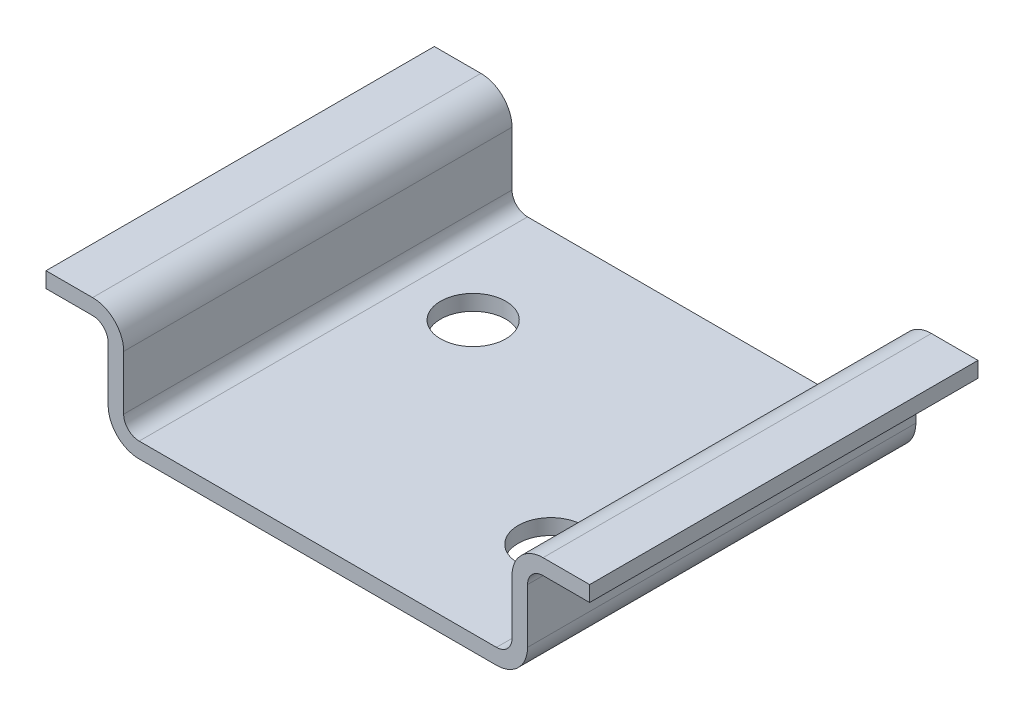
ISO-10303-21;
HEADER;
FILE_DESCRIPTION(('STEP AP214'),'2;1');
FILE_NAME('part.step','',(''),(''),'','','');
FILE_SCHEMA(('AUTOMOTIVE_DESIGN { 1 0 10303 214 1 1 1 1 }'));
ENDSEC;
DATA;
#1=APPLICATION_CONTEXT('core data for automotive mechanical design processes');
#2=APPLICATION_PROTOCOL_DEFINITION('international standard','automotive_design',2000,#1);
#3=PRODUCT_CONTEXT('',#1,'mechanical');
#4=PRODUCT('Part','Part','',(#3));
#5=PRODUCT_RELATED_PRODUCT_CATEGORY('part','',(#4));
#6=PRODUCT_DEFINITION_FORMATION('','',#4);
#7=PRODUCT_DEFINITION_CONTEXT('part definition',#1,'design');
#8=PRODUCT_DEFINITION('design','',#6,#7);
#9=PRODUCT_DEFINITION_SHAPE('','',#8);
#10=(LENGTH_UNIT() NAMED_UNIT(*) SI_UNIT(.MILLI.,.METRE.));
#11=(NAMED_UNIT(*) PLANE_ANGLE_UNIT() SI_UNIT($,.RADIAN.));
#12=(NAMED_UNIT(*) SI_UNIT($,.STERADIAN.) SOLID_ANGLE_UNIT());
#13=UNCERTAINTY_MEASURE_WITH_UNIT(LENGTH_MEASURE(1.E-05),#10,'distance_accuracy_value','');
#14=(GEOMETRIC_REPRESENTATION_CONTEXT(3) GLOBAL_UNCERTAINTY_ASSIGNED_CONTEXT((#13)) GLOBAL_UNIT_ASSIGNED_CONTEXT((#10,
#11,#12)) REPRESENTATION_CONTEXT('',''));
#15=CARTESIAN_POINT('',(0.,0.,0.));
#16=DIRECTION('',(0.,0.,1.));
#17=DIRECTION('',(1.,0.,0.));
#18=AXIS2_PLACEMENT_3D('',#15,#16,#17);
#19=CARTESIAN_POINT('',(-17.5,7.5,90.));
#20=DIRECTION('',(1.,0.,0.));
#21=DIRECTION('',(0.,0.,-1.));
#22=AXIS2_PLACEMENT_3D('',#19,#20,#21);
#23=PLANE('',#22);
#24=DIRECTION('',(0.,-1.,0.));
#25=VECTOR('',#24,1.);
#26=CARTESIAN_POINT('',(-17.5,7.5,25.));
#27=LINE('',#26,#25);
#28=CARTESIAN_POINT('',(-17.5,7.5,25.));
#29=VERTEX_POINT('',#28);
#30=CARTESIAN_POINT('',(-17.5,6.5,25.));
#31=VERTEX_POINT('',#30);
#32=EDGE_CURVE('E164',#29,#31,#27,.T.);
#33=ORIENTED_EDGE('',*,*,#32,.F.);
#34=DIRECTION('',(0.,0.,-1.));
#35=VECTOR('',#34,1.);
#36=CARTESIAN_POINT('',(-17.5,7.5,90.));
#37=LINE('',#36,#35);
#38=CARTESIAN_POINT('',(-17.5,7.5,0.));
#39=VERTEX_POINT('',#38);
#40=EDGE_CURVE('E50',#29,#39,#37,.T.);
#41=ORIENTED_EDGE('',*,*,#40,.T.);
#42=DIRECTION('',(0.,-1.,0.));
#43=VECTOR('',#42,1.);
#44=CARTESIAN_POINT('',(-17.5,7.5,0.));
#45=LINE('',#44,#43);
#46=CARTESIAN_POINT('',(-17.5,6.5,0.));
#47=VERTEX_POINT('',#46);
#48=EDGE_CURVE('E231',#39,#47,#45,.T.);
#49=ORIENTED_EDGE('',*,*,#48,.T.);
#50=DIRECTION('',(0.,0.,-1.));
#51=VECTOR('',#50,1.);
#52=CARTESIAN_POINT('',(-17.5,6.5,90.));
#53=LINE('',#52,#51);
#54=EDGE_CURVE('E11',#31,#47,#53,.T.);
#55=ORIENTED_EDGE('',*,*,#54,.F.);
#56=EDGE_LOOP('',(#33,#41,#49,#55));
#57=FACE_BOUND('',#56,.T.);
#58=ADVANCED_FACE('F28',(#57),#23,.F.);
#59=CARTESIAN_POINT('',(-17.5,6.5,90.));
#60=DIRECTION('',(0.,1.,0.));
#61=DIRECTION('',(-1.,0.,0.));
#62=AXIS2_PLACEMENT_3D('',#59,#60,#61);
#63=PLANE('',#62);
#64=DIRECTION('',(1.,0.,0.));
#65=VECTOR('',#64,1.);
#66=CARTESIAN_POINT('',(-17.5,6.5,25.));
#67=LINE('',#66,#65);
#68=CARTESIAN_POINT('',(-14.5,6.5,25.));
#69=VERTEX_POINT('',#68);
#70=EDGE_CURVE('E171',#31,#69,#67,.T.);
#71=ORIENTED_EDGE('',*,*,#70,.F.);
#72=ORIENTED_EDGE('',*,*,#54,.T.);
#73=DIRECTION('',(1.,0.,0.));
#74=VECTOR('',#73,1.);
#75=CARTESIAN_POINT('',(-17.5,6.5,0.));
#76=LINE('',#75,#74);
#77=CARTESIAN_POINT('',(-14.5,6.5,0.));
#78=VERTEX_POINT('',#77);
#79=EDGE_CURVE('E228',#47,#78,#76,.T.);
#80=ORIENTED_EDGE('',*,*,#79,.T.);
#81=DIRECTION('',(0.,0.,-1.));
#82=VECTOR('',#81,1.);
#83=CARTESIAN_POINT('',(-14.5,6.5,90.));
#84=LINE('',#83,#82);
#85=EDGE_CURVE('E35',#69,#78,#84,.T.);
#86=ORIENTED_EDGE('',*,*,#85,.F.);
#87=EDGE_LOOP('',(#71,#72,#80,#86));
#88=FACE_BOUND('',#87,.T.);
#89=ADVANCED_FACE('F229',(#88),#63,.F.);
#90=CARTESIAN_POINT('',(-14.5,5.5,90.));
#91=DIRECTION('',(0.,0.,-1.));
#92=DIRECTION('',(-1.,0.,0.));
#93=AXIS2_PLACEMENT_3D('',#90,#91,#92);
#94=CYLINDRICAL_SURFACE('',#93,1.);
#95=CARTESIAN_POINT('',(-14.5,5.5,25.));
#96=DIRECTION('',(0.,0.,-1.));
#97=DIRECTION('',(1.,0.,0.));
#98=AXIS2_PLACEMENT_3D('',#95,#96,#97);
#99=CIRCLE('',#98,1.);
#100=CARTESIAN_POINT('',(-13.5,5.49999999999999,25.));
#101=VERTEX_POINT('',#100);
#102=EDGE_CURVE('E225',#69,#101,#99,.T.);
#103=ORIENTED_EDGE('',*,*,#102,.F.);
#104=ORIENTED_EDGE('',*,*,#85,.T.);
#105=CARTESIAN_POINT('',(-14.5,5.5,0.));
#106=DIRECTION('',(0.,0.,-1.));
#107=DIRECTION('',(-1.,0.,0.));
#108=AXIS2_PLACEMENT_3D('',#105,#106,#107);
#109=CIRCLE('',#108,1.);
#110=CARTESIAN_POINT('',(-13.5,5.49999999999999,0.));
#111=VERTEX_POINT('',#110);
#112=EDGE_CURVE('E223',#78,#111,#109,.T.);
#113=ORIENTED_EDGE('',*,*,#112,.T.);
#114=DIRECTION('',(0.,0.,-1.));
#115=VECTOR('',#114,1.);
#116=CARTESIAN_POINT('',(-13.5,5.49999999999999,90.));
#117=LINE('',#116,#115);
#118=EDGE_CURVE('E214',#101,#111,#117,.T.);
#119=ORIENTED_EDGE('',*,*,#118,.F.);
#120=EDGE_LOOP('',(#103,#104,#113,#119));
#121=FACE_BOUND('',#120,.T.);
#122=ADVANCED_FACE('F220',(#121),#94,.F.);
#123=CARTESIAN_POINT('',(-13.5,5.49999999999999,90.));
#124=DIRECTION('',(1.,0.,0.));
#125=DIRECTION('',(0.,0.,-1.));
#126=AXIS2_PLACEMENT_3D('',#123,#124,#125);
#127=PLANE('',#126);
#128=DIRECTION('',(0.,-1.,0.));
#129=VECTOR('',#128,1.);
#130=CARTESIAN_POINT('',(-13.5,5.49999999999999,25.));
#131=LINE('',#130,#129);
#132=CARTESIAN_POINT('',(-13.5,2.00000000000001,25.));
#133=VERTEX_POINT('',#132);
#134=EDGE_CURVE('E318',#101,#133,#131,.T.);
#135=ORIENTED_EDGE('',*,*,#134,.F.);
#136=ORIENTED_EDGE('',*,*,#118,.T.);
#137=DIRECTION('',(0.,-1.,0.));
#138=VECTOR('',#137,1.);
#139=CARTESIAN_POINT('',(-13.5,5.49999999999999,0.));
#140=LINE('',#139,#138);
#141=CARTESIAN_POINT('',(-13.5,2.00000000000001,0.));
#142=VERTEX_POINT('',#141);
#143=EDGE_CURVE('E236',#111,#142,#140,.T.);
#144=ORIENTED_EDGE('',*,*,#143,.T.);
#145=DIRECTION('',(0.,0.,-1.));
#146=VECTOR('',#145,1.);
#147=CARTESIAN_POINT('',(-13.5,2.00000000000001,90.));
#148=LINE('',#147,#146);
#149=EDGE_CURVE('E212',#133,#142,#148,.T.);
#150=ORIENTED_EDGE('',*,*,#149,.F.);
#151=EDGE_LOOP('',(#135,#136,#144,#150));
#152=FACE_BOUND('',#151,.T.);
#153=ADVANCED_FACE('F376',(#152),#127,.F.);
#154=CARTESIAN_POINT('',(-11.5,2.,90.));
#155=DIRECTION('',(0.,0.,-1.));
#156=DIRECTION('',(-1.,0.,0.));
#157=AXIS2_PLACEMENT_3D('',#154,#155,#156);
#158=CYLINDRICAL_SURFACE('',#157,2.);
#159=CARTESIAN_POINT('',(-11.5,2.,25.));
#160=DIRECTION('',(0.,0.,1.));
#161=DIRECTION('',(1.,0.,0.));
#162=AXIS2_PLACEMENT_3D('',#159,#160,#161);
#163=CIRCLE('',#162,2.);
#164=CARTESIAN_POINT('',(-11.5,0.,25.));
#165=VERTEX_POINT('',#164);
#166=EDGE_CURVE('E316',#133,#165,#163,.T.);
#167=ORIENTED_EDGE('',*,*,#166,.F.);
#168=ORIENTED_EDGE('',*,*,#149,.T.);
#169=CARTESIAN_POINT('',(-11.5,2.,0.));
#170=DIRECTION('',(0.,0.,1.));
#171=DIRECTION('',(1.,0.,0.));
#172=AXIS2_PLACEMENT_3D('',#169,#170,#171);
#173=CIRCLE('',#172,2.);
#174=CARTESIAN_POINT('',(-11.5,0.,0.));
#175=VERTEX_POINT('',#174);
#176=EDGE_CURVE('E238',#142,#175,#173,.T.);
#177=ORIENTED_EDGE('',*,*,#176,.T.);
#178=DIRECTION('',(0.,0.,-1.));
#179=VECTOR('',#178,1.);
#180=CARTESIAN_POINT('',(-11.5,0.,90.));
#181=LINE('',#180,#179);
#182=EDGE_CURVE('E210',#165,#175,#181,.T.);
#183=ORIENTED_EDGE('',*,*,#182,.F.);
#184=EDGE_LOOP('',(#167,#168,#177,#183));
#185=FACE_BOUND('',#184,.T.);
#186=ADVANCED_FACE('F381',(#185),#158,.T.);
#187=CARTESIAN_POINT('',(-11.5,0.,90.));
#188=DIRECTION('',(0.,1.,0.));
#189=DIRECTION('',(0.,0.,1.));
#190=AXIS2_PLACEMENT_3D('',#187,#188,#189);
#191=PLANE('',#190);
#192=CARTESIAN_POINT('',(7.5,0.,17.5));
#193=DIRECTION('',(0.,1.,0.));
#194=DIRECTION('',(0.,0.,1.));
#195=AXIS2_PLACEMENT_3D('',#192,#193,#194);
#196=CIRCLE('',#195,2.1);
#197=CARTESIAN_POINT('',(7.5,0.,19.6));
#198=VERTEX_POINT('',#197);
#199=EDGE_CURVE('E327',#198,#198,#196,.T.);
#200=ORIENTED_EDGE('',*,*,#199,.T.);
#201=EDGE_LOOP('',(#200));
#202=FACE_BOUND('',#201,.T.);
#203=CARTESIAN_POINT('',(-7.5,0.,7.5));
#204=DIRECTION('',(0.,1.,0.));
#205=DIRECTION('',(0.,0.,1.));
#206=AXIS2_PLACEMENT_3D('',#203,#204,#205);
#207=CIRCLE('',#206,2.1);
#208=CARTESIAN_POINT('',(-7.5,0.,9.6));
#209=VERTEX_POINT('',#208);
#210=EDGE_CURVE('E168',#209,#209,#207,.T.);
#211=ORIENTED_EDGE('',*,*,#210,.T.);
#212=EDGE_LOOP('',(#211));
#213=FACE_BOUND('',#212,.T.);
#214=DIRECTION('',(1.,0.,0.));
#215=VECTOR('',#214,1.);
#216=CARTESIAN_POINT('',(-11.5,0.,25.));
#217=LINE('',#216,#215);
#218=CARTESIAN_POINT('',(11.5,0.,25.));
#219=VERTEX_POINT('',#218);
#220=EDGE_CURVE('E314',#165,#219,#217,.T.);
#221=ORIENTED_EDGE('',*,*,#220,.F.);
#222=ORIENTED_EDGE('',*,*,#182,.T.);
#223=DIRECTION('',(1.,0.,0.));
#224=VECTOR('',#223,1.);
#225=CARTESIAN_POINT('',(-11.5,0.,0.));
#226=LINE('',#225,#224);
#227=CARTESIAN_POINT('',(11.5,0.,0.));
#228=VERTEX_POINT('',#227);
#229=EDGE_CURVE('E244',#175,#228,#226,.T.);
#230=ORIENTED_EDGE('',*,*,#229,.T.);
#231=DIRECTION('',(0.,0.,-1.));
#232=VECTOR('',#231,1.);
#233=CARTESIAN_POINT('',(11.5,0.,90.));
#234=LINE('',#233,#232);
#235=EDGE_CURVE('E208',#219,#228,#234,.T.);
#236=ORIENTED_EDGE('',*,*,#235,.F.);
#237=EDGE_LOOP('',(#221,#222,#230,#236));
#238=FACE_BOUND('',#237,.T.);
#239=ADVANCED_FACE('F385',(#202,#213,#238),#191,.F.);
#240=CARTESIAN_POINT('',(11.5,2.,90.));
#241=DIRECTION('',(0.,0.,-1.));
#242=DIRECTION('',(-1.,0.,0.));
#243=AXIS2_PLACEMENT_3D('',#240,#241,#242);
#244=CYLINDRICAL_SURFACE('',#243,2.);
#245=CARTESIAN_POINT('',(11.5,2.,25.));
#246=DIRECTION('',(0.,0.,1.));
#247=DIRECTION('',(1.,0.,0.));
#248=AXIS2_PLACEMENT_3D('',#245,#246,#247);
#249=CIRCLE('',#248,2.);
#250=CARTESIAN_POINT('',(13.5,2.00000000000002,25.));
#251=VERTEX_POINT('',#250);
#252=EDGE_CURVE('E312',#219,#251,#249,.T.);
#253=ORIENTED_EDGE('',*,*,#252,.F.);
#254=ORIENTED_EDGE('',*,*,#235,.T.);
#255=CARTESIAN_POINT('',(11.5,2.,0.));
#256=DIRECTION('',(0.,0.,1.));
#257=DIRECTION('',(-1.,0.,0.));
#258=AXIS2_PLACEMENT_3D('',#255,#256,#257);
#259=CIRCLE('',#258,2.);
#260=CARTESIAN_POINT('',(13.5,2.00000000000003,0.));
#261=VERTEX_POINT('',#260);
#262=EDGE_CURVE('E247',#228,#261,#259,.T.);
#263=ORIENTED_EDGE('',*,*,#262,.T.);
#264=DIRECTION('',(0.,0.,-1.));
#265=VECTOR('',#264,1.);
#266=CARTESIAN_POINT('',(13.5,2.00000000000003,90.));
#267=LINE('',#266,#265);
#268=EDGE_CURVE('E206',#251,#261,#267,.T.);
#269=ORIENTED_EDGE('',*,*,#268,.F.);
#270=EDGE_LOOP('',(#253,#254,#263,#269));
#271=FACE_BOUND('',#270,.T.);
#272=ADVANCED_FACE('F389',(#271),#244,.T.);
#273=CARTESIAN_POINT('',(13.5,5.49999999999999,90.));
#274=DIRECTION('',(-1.,0.,0.));
#275=DIRECTION('',(0.,-1.,0.));
#276=AXIS2_PLACEMENT_3D('',#273,#274,#275);
#277=PLANE('',#276);
#278=DIRECTION('',(0.,1.,0.));
#279=VECTOR('',#278,1.);
#280=CARTESIAN_POINT('',(13.5,2.00000000000002,25.));
#281=LINE('',#280,#279);
#282=CARTESIAN_POINT('',(13.5,5.49999999999999,25.));
#283=VERTEX_POINT('',#282);
#284=EDGE_CURVE('E310',#251,#283,#281,.T.);
#285=ORIENTED_EDGE('',*,*,#284,.F.);
#286=ORIENTED_EDGE('',*,*,#268,.T.);
#287=DIRECTION('',(0.,1.,0.));
#288=VECTOR('',#287,1.);
#289=CARTESIAN_POINT('',(13.5,5.49999999999999,0.));
#290=LINE('',#289,#288);
#291=CARTESIAN_POINT('',(13.5,5.49999999999999,0.));
#292=VERTEX_POINT('',#291);
#293=EDGE_CURVE('E250',#261,#292,#290,.T.);
#294=ORIENTED_EDGE('',*,*,#293,.T.);
#295=DIRECTION('',(0.,0.,-1.));
#296=VECTOR('',#295,1.);
#297=CARTESIAN_POINT('',(13.5,5.49999999999999,90.));
#298=LINE('',#297,#296);
#299=EDGE_CURVE('E204',#283,#292,#298,.T.);
#300=ORIENTED_EDGE('',*,*,#299,.F.);
#301=EDGE_LOOP('',(#285,#286,#294,#300));
#302=FACE_BOUND('',#301,.T.);
#303=ADVANCED_FACE('F393',(#302),#277,.F.);
#304=CARTESIAN_POINT('',(14.5,5.5,90.));
#305=DIRECTION('',(0.,0.,-1.));
#306=DIRECTION('',(-1.,0.,0.));
#307=AXIS2_PLACEMENT_3D('',#304,#305,#306);
#308=CYLINDRICAL_SURFACE('',#307,1.);
#309=CARTESIAN_POINT('',(14.5,5.5,25.));
#310=DIRECTION('',(0.,0.,-1.));
#311=DIRECTION('',(1.,0.,0.));
#312=AXIS2_PLACEMENT_3D('',#309,#310,#311);
#313=CIRCLE('',#312,1.);
#314=CARTESIAN_POINT('',(14.5,6.5,25.));
#315=VERTEX_POINT('',#314);
#316=EDGE_CURVE('E308',#283,#315,#313,.T.);
#317=ORIENTED_EDGE('',*,*,#316,.F.);
#318=ORIENTED_EDGE('',*,*,#299,.T.);
#319=CARTESIAN_POINT('',(14.5,5.5,0.));
#320=DIRECTION('',(0.,0.,-1.));
#321=DIRECTION('',(1.,0.,0.));
#322=AXIS2_PLACEMENT_3D('',#319,#320,#321);
#323=CIRCLE('',#322,1.);
#324=CARTESIAN_POINT('',(14.5,6.5,0.));
#325=VERTEX_POINT('',#324);
#326=EDGE_CURVE('E253',#292,#325,#323,.T.);
#327=ORIENTED_EDGE('',*,*,#326,.T.);
#328=DIRECTION('',(0.,0.,-1.));
#329=VECTOR('',#328,1.);
#330=CARTESIAN_POINT('',(14.5,6.5,90.));
#331=LINE('',#330,#329);
#332=EDGE_CURVE('E202',#315,#325,#331,.T.);
#333=ORIENTED_EDGE('',*,*,#332,.F.);
#334=EDGE_LOOP('',(#317,#318,#327,#333));
#335=FACE_BOUND('',#334,.T.);
#336=ADVANCED_FACE('F397',(#335),#308,.F.);
#337=CARTESIAN_POINT('',(17.5,6.5,90.));
#338=DIRECTION('',(0.,1.,0.));
#339=DIRECTION('',(-1.,0.,0.));
#340=AXIS2_PLACEMENT_3D('',#337,#338,#339);
#341=PLANE('',#340);
#342=DIRECTION('',(1.,0.,0.));
#343=VECTOR('',#342,1.);
#344=CARTESIAN_POINT('',(14.5,6.5,25.));
#345=LINE('',#344,#343);
#346=CARTESIAN_POINT('',(17.5,6.5,25.));
#347=VERTEX_POINT('',#346);
#348=EDGE_CURVE('E306',#315,#347,#345,.T.);
#349=ORIENTED_EDGE('',*,*,#348,.F.);
#350=ORIENTED_EDGE('',*,*,#332,.T.);
#351=DIRECTION('',(1.,0.,0.));
#352=VECTOR('',#351,1.);
#353=CARTESIAN_POINT('',(17.5,6.5,0.));
#354=LINE('',#353,#352);
#355=CARTESIAN_POINT('',(17.5,6.5,0.));
#356=VERTEX_POINT('',#355);
#357=EDGE_CURVE('E256',#325,#356,#354,.T.);
#358=ORIENTED_EDGE('',*,*,#357,.T.);
#359=DIRECTION('',(0.,0.,-1.));
#360=VECTOR('',#359,1.);
#361=CARTESIAN_POINT('',(17.5,6.5,90.));
#362=LINE('',#361,#360);
#363=EDGE_CURVE('E200',#347,#356,#362,.T.);
#364=ORIENTED_EDGE('',*,*,#363,.F.);
#365=EDGE_LOOP('',(#349,#350,#358,#364));
#366=FACE_BOUND('',#365,.T.);
#367=ADVANCED_FACE('F401',(#366),#341,.F.);
#368=CARTESIAN_POINT('',(17.5,7.5,90.));
#369=DIRECTION('',(-1.,0.,0.));
#370=DIRECTION('',(0.,0.,1.));
#371=AXIS2_PLACEMENT_3D('',#368,#369,#370);
#372=PLANE('',#371);
#373=DIRECTION('',(0.,1.,0.));
#374=VECTOR('',#373,1.);
#375=CARTESIAN_POINT('',(17.5,6.5,25.));
#376=LINE('',#375,#374);
#377=CARTESIAN_POINT('',(17.5,7.5,25.));
#378=VERTEX_POINT('',#377);
#379=EDGE_CURVE('E304',#347,#378,#376,.T.);
#380=ORIENTED_EDGE('',*,*,#379,.F.);
#381=ORIENTED_EDGE('',*,*,#363,.T.);
#382=DIRECTION('',(0.,1.,0.));
#383=VECTOR('',#382,1.);
#384=CARTESIAN_POINT('',(17.5,7.5,0.));
#385=LINE('',#384,#383);
#386=CARTESIAN_POINT('',(17.5,7.5,0.));
#387=VERTEX_POINT('',#386);
#388=EDGE_CURVE('E259',#356,#387,#385,.T.);
#389=ORIENTED_EDGE('',*,*,#388,.T.);
#390=DIRECTION('',(0.,0.,-1.));
#391=VECTOR('',#390,1.);
#392=CARTESIAN_POINT('',(17.5,7.5,90.));
#393=LINE('',#392,#391);
#394=EDGE_CURVE('E198',#378,#387,#393,.T.);
#395=ORIENTED_EDGE('',*,*,#394,.F.);
#396=EDGE_LOOP('',(#380,#381,#389,#395));
#397=FACE_BOUND('',#396,.T.);
#398=ADVANCED_FACE('F405',(#397),#372,.F.);
#399=CARTESIAN_POINT('',(17.5,7.5,90.));
#400=DIRECTION('',(0.,-1.,0.));
#401=DIRECTION('',(1.,0.,0.));
#402=AXIS2_PLACEMENT_3D('',#399,#400,#401);
#403=PLANE('',#402);
#404=DIRECTION('',(-1.,0.,0.));
#405=VECTOR('',#404,1.);
#406=CARTESIAN_POINT('',(17.5,7.5,25.));
#407=LINE('',#406,#405);
#408=CARTESIAN_POINT('',(14.5,7.5,25.));
#409=VERTEX_POINT('',#408);
#410=EDGE_CURVE('E302',#378,#409,#407,.T.);
#411=ORIENTED_EDGE('',*,*,#410,.F.);
#412=ORIENTED_EDGE('',*,*,#394,.T.);
#413=DIRECTION('',(-1.,0.,0.));
#414=VECTOR('',#413,1.);
#415=CARTESIAN_POINT('',(17.5,7.5,0.));
#416=LINE('',#415,#414);
#417=CARTESIAN_POINT('',(14.5,7.5,0.));
#418=VERTEX_POINT('',#417);
#419=EDGE_CURVE('E262',#387,#418,#416,.T.);
#420=ORIENTED_EDGE('',*,*,#419,.T.);
#421=DIRECTION('',(0.,0.,-1.));
#422=VECTOR('',#421,1.);
#423=CARTESIAN_POINT('',(14.5,7.5,90.));
#424=LINE('',#423,#422);
#425=EDGE_CURVE('E196',#409,#418,#424,.T.);
#426=ORIENTED_EDGE('',*,*,#425,.F.);
#427=EDGE_LOOP('',(#411,#412,#420,#426));
#428=FACE_BOUND('',#427,.T.);
#429=ADVANCED_FACE('F409',(#428),#403,.F.);
#430=CARTESIAN_POINT('',(14.5,5.5,90.));
#431=DIRECTION('',(0.,0.,-1.));
#432=DIRECTION('',(-1.,0.,0.));
#433=AXIS2_PLACEMENT_3D('',#430,#431,#432);
#434=CYLINDRICAL_SURFACE('',#433,2.);
#435=CARTESIAN_POINT('',(14.5,5.5,25.));
#436=DIRECTION('',(0.,0.,1.));
#437=DIRECTION('',(1.,0.,0.));
#438=AXIS2_PLACEMENT_3D('',#435,#436,#437);
#439=CIRCLE('',#438,2.);
#440=CARTESIAN_POINT('',(12.5,5.49999999999999,25.));
#441=VERTEX_POINT('',#440);
#442=EDGE_CURVE('E300',#409,#441,#439,.T.);
#443=ORIENTED_EDGE('',*,*,#442,.F.);
#444=ORIENTED_EDGE('',*,*,#425,.T.);
#445=CARTESIAN_POINT('',(14.5,5.5,0.));
#446=DIRECTION('',(0.,0.,1.));
#447=DIRECTION('',(1.,0.,0.));
#448=AXIS2_PLACEMENT_3D('',#445,#446,#447);
#449=CIRCLE('',#448,2.);
#450=CARTESIAN_POINT('',(12.5,5.49999999999999,0.));
#451=VERTEX_POINT('',#450);
#452=EDGE_CURVE('E265',#418,#451,#449,.T.);
#453=ORIENTED_EDGE('',*,*,#452,.T.);
#454=DIRECTION('',(0.,0.,-1.));
#455=VECTOR('',#454,1.);
#456=CARTESIAN_POINT('',(12.5,5.49999999999999,90.));
#457=LINE('',#456,#455);
#458=EDGE_CURVE('E194',#441,#451,#457,.T.);
#459=ORIENTED_EDGE('',*,*,#458,.F.);
#460=EDGE_LOOP('',(#443,#444,#453,#459));
#461=FACE_BOUND('',#460,.T.);
#462=ADVANCED_FACE('F413',(#461),#434,.T.);
#463=CARTESIAN_POINT('',(12.5,5.49999999999999,90.));
#464=DIRECTION('',(1.,0.,0.));
#465=DIRECTION('',(0.,0.,-1.));
#466=AXIS2_PLACEMENT_3D('',#463,#464,#465);
#467=PLANE('',#466);
#468=DIRECTION('',(0.,-1.,0.));
#469=VECTOR('',#468,1.);
#470=CARTESIAN_POINT('',(12.5,5.49999999999999,25.));
#471=LINE('',#470,#469);
#472=CARTESIAN_POINT('',(12.5,2.00000000000001,25.));
#473=VERTEX_POINT('',#472);
#474=EDGE_CURVE('E298',#441,#473,#471,.T.);
#475=ORIENTED_EDGE('',*,*,#474,.F.);
#476=ORIENTED_EDGE('',*,*,#458,.T.);
#477=DIRECTION('',(0.,-1.,0.));
#478=VECTOR('',#477,1.);
#479=CARTESIAN_POINT('',(12.5,5.49999999999999,0.));
#480=LINE('',#479,#478);
#481=CARTESIAN_POINT('',(12.5,2.00000000000001,0.));
#482=VERTEX_POINT('',#481);
#483=EDGE_CURVE('E268',#451,#482,#480,.T.);
#484=ORIENTED_EDGE('',*,*,#483,.T.);
#485=DIRECTION('',(0.,0.,-1.));
#486=VECTOR('',#485,1.);
#487=CARTESIAN_POINT('',(12.5,2.00000000000001,90.));
#488=LINE('',#487,#486);
#489=EDGE_CURVE('E192',#473,#482,#488,.T.);
#490=ORIENTED_EDGE('',*,*,#489,.F.);
#491=EDGE_LOOP('',(#475,#476,#484,#490));
#492=FACE_BOUND('',#491,.T.);
#493=ADVANCED_FACE('F417',(#492),#467,.F.);
#494=CARTESIAN_POINT('',(11.5,2.,90.));
#495=DIRECTION('',(0.,0.,-1.));
#496=DIRECTION('',(-1.,0.,0.));
#497=AXIS2_PLACEMENT_3D('',#494,#495,#496);
#498=CYLINDRICAL_SURFACE('',#497,1.);
#499=CARTESIAN_POINT('',(11.5,2.,25.));
#500=DIRECTION('',(0.,0.,-1.));
#501=DIRECTION('',(1.,0.,0.));
#502=AXIS2_PLACEMENT_3D('',#499,#500,#501);
#503=CIRCLE('',#502,1.);
#504=CARTESIAN_POINT('',(11.5,0.999999999999997,25.));
#505=VERTEX_POINT('',#504);
#506=EDGE_CURVE('E296',#473,#505,#503,.T.);
#507=ORIENTED_EDGE('',*,*,#506,.F.);
#508=ORIENTED_EDGE('',*,*,#489,.T.);
#509=CARTESIAN_POINT('',(11.5,2.,0.));
#510=DIRECTION('',(0.,0.,-1.));
#511=DIRECTION('',(-1.,0.,0.));
#512=AXIS2_PLACEMENT_3D('',#509,#510,#511);
#513=CIRCLE('',#512,1.);
#514=CARTESIAN_POINT('',(11.5,0.999999999999998,0.));
#515=VERTEX_POINT('',#514);
#516=EDGE_CURVE('E271',#482,#515,#513,.T.);
#517=ORIENTED_EDGE('',*,*,#516,.T.);
#518=DIRECTION('',(0.,0.,-1.));
#519=VECTOR('',#518,1.);
#520=CARTESIAN_POINT('',(11.5,0.999999999999998,90.));
#521=LINE('',#520,#519);
#522=EDGE_CURVE('E190',#505,#515,#521,.T.);
#523=ORIENTED_EDGE('',*,*,#522,.F.);
#524=EDGE_LOOP('',(#507,#508,#517,#523));
#525=FACE_BOUND('',#524,.T.);
#526=ADVANCED_FACE('F341',(#525),#498,.F.);
#527=CARTESIAN_POINT('',(-11.5,1.,90.));
#528=DIRECTION('',(0.,-1.,0.));
#529=DIRECTION('',(1.,0.,0.));
#530=AXIS2_PLACEMENT_3D('',#527,#528,#529);
#531=PLANE('',#530);
#532=CARTESIAN_POINT('',(7.5,0.999999999999999,17.5));
#533=DIRECTION('',(0.,1.,0.));
#534=DIRECTION('',(-1.,0.,0.));
#535=AXIS2_PLACEMENT_3D('',#532,#533,#534);
#536=CIRCLE('',#535,2.1);
#537=CARTESIAN_POINT('',(5.4,0.999999999999999,17.5));
#538=VERTEX_POINT('',#537);
#539=EDGE_CURVE('E330',#538,#538,#536,.T.);
#540=ORIENTED_EDGE('',*,*,#539,.F.);
#541=EDGE_LOOP('',(#540));
#542=FACE_BOUND('',#541,.T.);
#543=CARTESIAN_POINT('',(-7.5,1.,7.5));
#544=DIRECTION('',(0.,1.,0.));
#545=DIRECTION('',(-1.,0.,0.));
#546=AXIS2_PLACEMENT_3D('',#543,#544,#545);
#547=CIRCLE('',#546,2.1);
#548=CARTESIAN_POINT('',(-9.6,1.,7.5));
#549=VERTEX_POINT('',#548);
#550=EDGE_CURVE('E324',#549,#549,#547,.T.);
#551=ORIENTED_EDGE('',*,*,#550,.F.);
#552=EDGE_LOOP('',(#551));
#553=FACE_BOUND('',#552,.T.);
#554=DIRECTION('',(-1.,0.,0.));
#555=VECTOR('',#554,1.);
#556=CARTESIAN_POINT('',(11.5,0.999999999999998,25.));
#557=LINE('',#556,#555);
#558=CARTESIAN_POINT('',(-11.5,1.,25.));
#559=VERTEX_POINT('',#558);
#560=EDGE_CURVE('E294',#505,#559,#557,.T.);
#561=ORIENTED_EDGE('',*,*,#560,.F.);
#562=ORIENTED_EDGE('',*,*,#522,.T.);
#563=DIRECTION('',(-1.,0.,0.));
#564=VECTOR('',#563,1.);
#565=CARTESIAN_POINT('',(-11.5,1.,0.));
#566=LINE('',#565,#564);
#567=CARTESIAN_POINT('',(-11.5,1.,0.));
#568=VERTEX_POINT('',#567);
#569=EDGE_CURVE('E274',#515,#568,#566,.T.);
#570=ORIENTED_EDGE('',*,*,#569,.T.);
#571=DIRECTION('',(0.,0.,-1.));
#572=VECTOR('',#571,1.);
#573=CARTESIAN_POINT('',(-11.5,1.,90.));
#574=LINE('',#573,#572);
#575=EDGE_CURVE('E188',#559,#568,#574,.T.);
#576=ORIENTED_EDGE('',*,*,#575,.F.);
#577=EDGE_LOOP('',(#561,#562,#570,#576));
#578=FACE_BOUND('',#577,.T.);
#579=ADVANCED_FACE('F337',(#542,#553,#578),#531,.F.);
#580=CARTESIAN_POINT('',(-11.5,2.,90.));
#581=DIRECTION('',(0.,0.,-1.));
#582=DIRECTION('',(-1.,0.,0.));
#583=AXIS2_PLACEMENT_3D('',#580,#581,#582);
#584=CYLINDRICAL_SURFACE('',#583,1.);
#585=CARTESIAN_POINT('',(-11.5,2.,25.));
#586=DIRECTION('',(0.,0.,-1.));
#587=DIRECTION('',(1.,0.,0.));
#588=AXIS2_PLACEMENT_3D('',#585,#586,#587);
#589=CIRCLE('',#588,1.);
#590=CARTESIAN_POINT('',(-12.5,2.00000000000001,25.));
#591=VERTEX_POINT('',#590);
#592=EDGE_CURVE('E292',#559,#591,#589,.T.);
#593=ORIENTED_EDGE('',*,*,#592,.F.);
#594=ORIENTED_EDGE('',*,*,#575,.T.);
#595=CARTESIAN_POINT('',(-11.5,2.,0.));
#596=DIRECTION('',(0.,0.,-1.));
#597=DIRECTION('',(-1.,0.,0.));
#598=AXIS2_PLACEMENT_3D('',#595,#596,#597);
#599=CIRCLE('',#598,1.);
#600=CARTESIAN_POINT('',(-12.5,2.00000000000001,0.));
#601=VERTEX_POINT('',#600);
#602=EDGE_CURVE('E277',#568,#601,#599,.T.);
#603=ORIENTED_EDGE('',*,*,#602,.T.);
#604=DIRECTION('',(0.,0.,-1.));
#605=VECTOR('',#604,1.);
#606=CARTESIAN_POINT('',(-12.5,2.00000000000001,90.));
#607=LINE('',#606,#605);
#608=EDGE_CURVE('E186',#591,#601,#607,.T.);
#609=ORIENTED_EDGE('',*,*,#608,.F.);
#610=EDGE_LOOP('',(#593,#594,#603,#609));
#611=FACE_BOUND('',#610,.T.);
#612=ADVANCED_FACE('F340',(#611),#584,.F.);
#613=CARTESIAN_POINT('',(-12.5,5.49999999999999,90.));
#614=DIRECTION('',(-1.,0.,0.));
#615=DIRECTION('',(0.,0.,1.));
#616=AXIS2_PLACEMENT_3D('',#613,#614,#615);
#617=PLANE('',#616);
#618=DIRECTION('',(0.,1.,0.));
#619=VECTOR('',#618,1.);
#620=CARTESIAN_POINT('',(-12.5,2.00000000000001,25.));
#621=LINE('',#620,#619);
#622=CARTESIAN_POINT('',(-12.5,5.49999999999999,25.));
#623=VERTEX_POINT('',#622);
#624=EDGE_CURVE('E288',#591,#623,#621,.T.);
#625=ORIENTED_EDGE('',*,*,#624,.F.);
#626=ORIENTED_EDGE('',*,*,#608,.T.);
#627=DIRECTION('',(0.,1.,0.));
#628=VECTOR('',#627,1.);
#629=CARTESIAN_POINT('',(-12.5,5.49999999999999,0.));
#630=LINE('',#629,#628);
#631=CARTESIAN_POINT('',(-12.5,5.49999999999999,0.));
#632=VERTEX_POINT('',#631);
#633=EDGE_CURVE('E280',#601,#632,#630,.T.);
#634=ORIENTED_EDGE('',*,*,#633,.T.);
#635=DIRECTION('',(0.,0.,-1.));
#636=VECTOR('',#635,1.);
#637=CARTESIAN_POINT('',(-12.5,5.49999999999999,90.));
#638=LINE('',#637,#636);
#639=EDGE_CURVE('E179',#623,#632,#638,.T.);
#640=ORIENTED_EDGE('',*,*,#639,.F.);
#641=EDGE_LOOP('',(#625,#626,#634,#640));
#642=FACE_BOUND('',#641,.T.);
#643=ADVANCED_FACE('F360',(#642),#617,.F.);
#644=CARTESIAN_POINT('',(-14.5,5.5,90.));
#645=DIRECTION('',(0.,0.,-1.));
#646=DIRECTION('',(-1.,0.,0.));
#647=AXIS2_PLACEMENT_3D('',#644,#645,#646);
#648=CYLINDRICAL_SURFACE('',#647,2.);
#649=CARTESIAN_POINT('',(-14.5,5.5,25.));
#650=DIRECTION('',(0.,0.,1.));
#651=DIRECTION('',(1.,0.,0.));
#652=AXIS2_PLACEMENT_3D('',#649,#650,#651);
#653=CIRCLE('',#652,2.);
#654=CARTESIAN_POINT('',(-14.5,7.5,25.));
#655=VERTEX_POINT('',#654);
#656=EDGE_CURVE('E42',#623,#655,#653,.T.);
#657=ORIENTED_EDGE('',*,*,#656,.F.);
#658=ORIENTED_EDGE('',*,*,#639,.T.);
#659=CARTESIAN_POINT('',(-14.5,5.5,0.));
#660=DIRECTION('',(0.,0.,1.));
#661=DIRECTION('',(-1.,0.,0.));
#662=AXIS2_PLACEMENT_3D('',#659,#660,#661);
#663=CIRCLE('',#662,2.);
#664=CARTESIAN_POINT('',(-14.5,7.5,0.));
#665=VERTEX_POINT('',#664);
#666=EDGE_CURVE('E181',#632,#665,#663,.T.);
#667=ORIENTED_EDGE('',*,*,#666,.T.);
#668=DIRECTION('',(0.,0.,-1.));
#669=VECTOR('',#668,1.);
#670=CARTESIAN_POINT('',(-14.5,7.5,90.));
#671=LINE('',#670,#669);
#672=EDGE_CURVE('E177',#655,#665,#671,.T.);
#673=ORIENTED_EDGE('',*,*,#672,.F.);
#674=EDGE_LOOP('',(#657,#658,#667,#673));
#675=FACE_BOUND('',#674,.T.);
#676=ADVANCED_FACE('F285',(#675),#648,.T.);
#677=CARTESIAN_POINT('',(-17.5,7.5,90.));
#678=DIRECTION('',(0.,-1.,0.));
#679=DIRECTION('',(0.,0.,-1.));
#680=AXIS2_PLACEMENT_3D('',#677,#678,#679);
#681=PLANE('',#680);
#682=DIRECTION('',(-1.,0.,0.));
#683=VECTOR('',#682,1.);
#684=CARTESIAN_POINT('',(-14.5,7.5,25.));
#685=LINE('',#684,#683);
#686=EDGE_CURVE('E162',#655,#29,#685,.T.);
#687=ORIENTED_EDGE('',*,*,#686,.F.);
#688=ORIENTED_EDGE('',*,*,#672,.T.);
#689=DIRECTION('',(-1.,0.,0.));
#690=VECTOR('',#689,1.);
#691=CARTESIAN_POINT('',(-17.5,7.5,0.));
#692=LINE('',#691,#690);
#693=EDGE_CURVE('E175',#665,#39,#692,.T.);
#694=ORIENTED_EDGE('',*,*,#693,.T.);
#695=ORIENTED_EDGE('',*,*,#40,.F.);
#696=EDGE_LOOP('',(#687,#688,#694,#695));
#697=FACE_BOUND('',#696,.T.);
#698=ADVANCED_FACE('F173',(#697),#681,.F.);
#699=CARTESIAN_POINT('',(-14.5,5.5,0.));
#700=DIRECTION('',(0.,0.,-1.));
#701=DIRECTION('',(-1.,0.,0.));
#702=AXIS2_PLACEMENT_3D('',#699,#700,#701);
#703=PLANE('',#702);
#704=ORIENTED_EDGE('',*,*,#48,.F.);
#705=ORIENTED_EDGE('',*,*,#693,.F.);
#706=ORIENTED_EDGE('',*,*,#666,.F.);
#707=ORIENTED_EDGE('',*,*,#633,.F.);
#708=ORIENTED_EDGE('',*,*,#602,.F.);
#709=ORIENTED_EDGE('',*,*,#569,.F.);
#710=ORIENTED_EDGE('',*,*,#516,.F.);
#711=ORIENTED_EDGE('',*,*,#483,.F.);
#712=ORIENTED_EDGE('',*,*,#452,.F.);
#713=ORIENTED_EDGE('',*,*,#419,.F.);
#714=ORIENTED_EDGE('',*,*,#388,.F.);
#715=ORIENTED_EDGE('',*,*,#357,.F.);
#716=ORIENTED_EDGE('',*,*,#326,.F.);
#717=ORIENTED_EDGE('',*,*,#293,.F.);
#718=ORIENTED_EDGE('',*,*,#262,.F.);
#719=ORIENTED_EDGE('',*,*,#229,.F.);
#720=ORIENTED_EDGE('',*,*,#176,.F.);
#721=ORIENTED_EDGE('',*,*,#143,.F.);
#722=ORIENTED_EDGE('',*,*,#112,.F.);
#723=ORIENTED_EDGE('',*,*,#79,.F.);
#724=EDGE_LOOP('',(#704,#705,#706,#707,#708,#709,#710,#711,#712,#713,#714,#715,#716,#717,#718,
#719,#720,#721,#722,#723));
#725=FACE_BOUND('',#724,.T.);
#726=ADVANCED_FACE('F233',(#725),#703,.T.);
#727=CARTESIAN_POINT('',(-14.5,5.5,25.));
#728=DIRECTION('',(0.,0.,1.));
#729=DIRECTION('',(1.,0.,0.));
#730=AXIS2_PLACEMENT_3D('',#727,#728,#729);
#731=PLANE('',#730);
#732=ORIENTED_EDGE('',*,*,#686,.T.);
#733=ORIENTED_EDGE('',*,*,#32,.T.);
#734=ORIENTED_EDGE('',*,*,#70,.T.);
#735=ORIENTED_EDGE('',*,*,#102,.T.);
#736=ORIENTED_EDGE('',*,*,#134,.T.);
#737=ORIENTED_EDGE('',*,*,#166,.T.);
#738=ORIENTED_EDGE('',*,*,#220,.T.);
#739=ORIENTED_EDGE('',*,*,#252,.T.);
#740=ORIENTED_EDGE('',*,*,#284,.T.);
#741=ORIENTED_EDGE('',*,*,#316,.T.);
#742=ORIENTED_EDGE('',*,*,#348,.T.);
#743=ORIENTED_EDGE('',*,*,#379,.T.);
#744=ORIENTED_EDGE('',*,*,#410,.T.);
#745=ORIENTED_EDGE('',*,*,#442,.T.);
#746=ORIENTED_EDGE('',*,*,#474,.T.);
#747=ORIENTED_EDGE('',*,*,#506,.T.);
#748=ORIENTED_EDGE('',*,*,#560,.T.);
#749=ORIENTED_EDGE('',*,*,#592,.T.);
#750=ORIENTED_EDGE('',*,*,#624,.T.);
#751=ORIENTED_EDGE('',*,*,#656,.T.);
#752=EDGE_LOOP('',(#732,#733,#734,#735,#736,#737,#738,#739,#740,#741,#742,#743,#744,#745,#746,
#747,#748,#749,#750,#751));
#753=FACE_BOUND('',#752,.T.);
#754=ADVANCED_FACE('F163',(#753),#731,.T.);
#755=CARTESIAN_POINT('',(-7.5,-9.,7.5));
#756=DIRECTION('',(0.,1.,0.));
#757=DIRECTION('',(-1.,0.,0.));
#758=AXIS2_PLACEMENT_3D('',#755,#756,#757);
#759=CYLINDRICAL_SURFACE('',#758,2.1);
#760=ORIENTED_EDGE('',*,*,#550,.T.);
#761=EDGE_LOOP('',(#760));
#762=FACE_BOUND('',#761,.T.);
#763=ORIENTED_EDGE('',*,*,#210,.F.);
#764=EDGE_LOOP('',(#763));
#765=FACE_BOUND('',#764,.T.);
#766=ADVANCED_FACE('F465',(#762,#765),#759,.F.);
#767=CARTESIAN_POINT('',(7.5,-9.,17.5));
#768=DIRECTION('',(0.,1.,0.));
#769=DIRECTION('',(-1.,0.,0.));
#770=AXIS2_PLACEMENT_3D('',#767,#768,#769);
#771=CYLINDRICAL_SURFACE('',#770,2.1);
#772=ORIENTED_EDGE('',*,*,#539,.T.);
#773=EDGE_LOOP('',(#772));
#774=FACE_BOUND('',#773,.T.);
#775=ORIENTED_EDGE('',*,*,#199,.F.);
#776=EDGE_LOOP('',(#775));
#777=FACE_BOUND('',#776,.T.);
#778=ADVANCED_FACE('F334',(#774,#777),#771,.F.);
#779=CLOSED_SHELL('',(#58,#89,#122,#153,#186,#239,#272,#303,#336,#367,#398,#429,#462,#493,#526,
#579,#612,#643,#676,#698,#726,#754,#766,#778));
#780=MANIFOLD_SOLID_BREP('B2',#779);
#781=ADVANCED_BREP_SHAPE_REPRESENTATION('',(#18,#780),#14);
#782=SHAPE_DEFINITION_REPRESENTATION(#9,#781);
ENDSEC;
END-ISO-10303-21;
